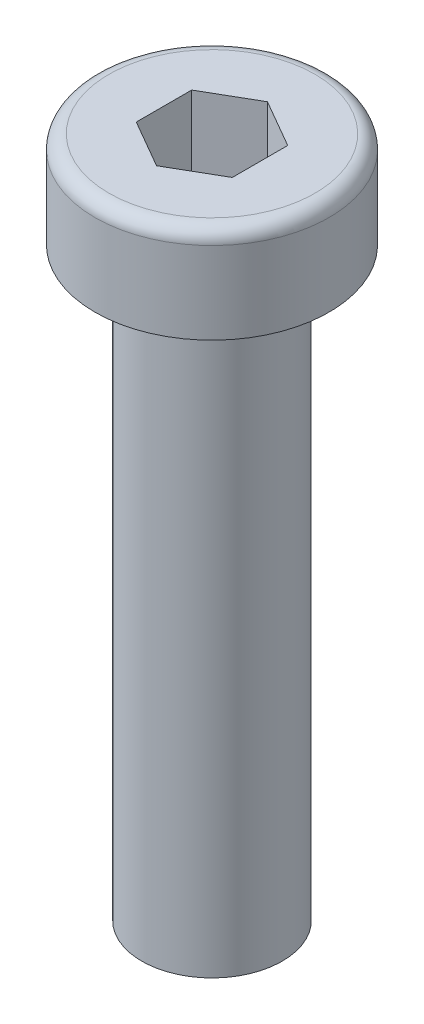
ISO-10303-21;
HEADER;
FILE_DESCRIPTION(('STEP AP214'),'2;1');
FILE_NAME('part.step','',(''),(''),'','','');
FILE_SCHEMA(('AUTOMOTIVE_DESIGN { 1 0 10303 214 1 1 1 1 }'));
ENDSEC;
DATA;
#1=APPLICATION_CONTEXT('core data for automotive mechanical design processes');
#2=APPLICATION_PROTOCOL_DEFINITION('international standard','automotive_design',2000,#1);
#3=PRODUCT_CONTEXT('',#1,'mechanical');
#4=PRODUCT('Part','Part','',(#3));
#5=PRODUCT_RELATED_PRODUCT_CATEGORY('part','',(#4));
#6=PRODUCT_DEFINITION_FORMATION('','',#4);
#7=PRODUCT_DEFINITION_CONTEXT('part definition',#1,'design');
#8=PRODUCT_DEFINITION('design','',#6,#7);
#9=PRODUCT_DEFINITION_SHAPE('','',#8);
#10=(LENGTH_UNIT() NAMED_UNIT(*) SI_UNIT(.MILLI.,.METRE.));
#11=(NAMED_UNIT(*) PLANE_ANGLE_UNIT() SI_UNIT($,.RADIAN.));
#12=(NAMED_UNIT(*) SI_UNIT($,.STERADIAN.) SOLID_ANGLE_UNIT());
#13=UNCERTAINTY_MEASURE_WITH_UNIT(LENGTH_MEASURE(1.E-05),#10,'distance_accuracy_value','');
#14=(GEOMETRIC_REPRESENTATION_CONTEXT(3) GLOBAL_UNCERTAINTY_ASSIGNED_CONTEXT((#13)) GLOBAL_UNIT_ASSIGNED_CONTEXT((#10,
#11,#12)) REPRESENTATION_CONTEXT('',''));
#15=CARTESIAN_POINT('',(0.,0.,0.));
#16=DIRECTION('',(0.,0.,1.));
#17=DIRECTION('',(1.,0.,0.));
#18=AXIS2_PLACEMENT_3D('',#15,#16,#17);
#19=CARTESIAN_POINT('',(0.,4.1,0.));
#20=DIRECTION('',(0.,-1.,0.));
#21=DIRECTION('',(0.,0.,-1.));
#22=AXIS2_PLACEMENT_3D('',#19,#20,#21);
#23=CYLINDRICAL_SURFACE('',#22,5.);
#24=CARTESIAN_POINT('',(0.,3.5,0.));
#25=DIRECTION('',(0.,1.,0.));
#26=DIRECTION('',(0.,0.,1.));
#27=AXIS2_PLACEMENT_3D('',#24,#25,#26);
#28=CIRCLE('',#27,5.);
#29=CARTESIAN_POINT('',(0.,3.5,5.));
#30=VERTEX_POINT('',#29);
#31=EDGE_CURVE('E37',#30,#30,#28,.F.);
#32=ORIENTED_EDGE('',*,*,#31,.T.);
#33=EDGE_LOOP('',(#32));
#34=FACE_BOUND('',#33,.T.);
#35=CARTESIAN_POINT('',(0.,0.,0.));
#36=DIRECTION('',(0.,1.,0.));
#37=DIRECTION('',(0.,0.,1.));
#38=AXIS2_PLACEMENT_3D('',#35,#36,#37);
#39=CIRCLE('',#38,5.);
#40=CARTESIAN_POINT('',(0.,0.,5.));
#41=VERTEX_POINT('',#40);
#42=EDGE_CURVE('E137',#41,#41,#39,.T.);
#43=ORIENTED_EDGE('',*,*,#42,.T.);
#44=EDGE_LOOP('',(#43));
#45=FACE_BOUND('',#44,.T.);
#46=ADVANCED_FACE('F33',(#34,#45),#23,.T.);
#47=CARTESIAN_POINT('',(0.,4.1,0.));
#48=DIRECTION('',(0.,1.,0.));
#49=DIRECTION('',(0.,0.,1.));
#50=AXIS2_PLACEMENT_3D('',#47,#48,#49);
#51=PLANE('',#50);
#52=DIRECTION('',(0.866025403784439,0.,0.5));
#53=VECTOR('',#52,1.);
#54=CARTESIAN_POINT('',(-2.05,4.1,1.18356805183873));
#55=LINE('',#54,#53);
#56=CARTESIAN_POINT('',(-2.05,4.1,1.18356805183873));
#57=VERTEX_POINT('',#56);
#58=CARTESIAN_POINT('',(0.,4.1,2.36713610367747));
#59=VERTEX_POINT('',#58);
#60=EDGE_CURVE('E49',#57,#59,#55,.T.);
#61=ORIENTED_EDGE('',*,*,#60,.F.);
#62=DIRECTION('',(0.,0.,1.));
#63=VECTOR('',#62,1.);
#64=CARTESIAN_POINT('',(-2.05,4.1,-1.18356805183873));
#65=LINE('',#64,#63);
#66=CARTESIAN_POINT('',(-2.05,4.1,-1.18356805183873));
#67=VERTEX_POINT('',#66);
#68=EDGE_CURVE('E133',#67,#57,#65,.T.);
#69=ORIENTED_EDGE('',*,*,#68,.F.);
#70=DIRECTION('',(-0.866025403784438,0.,0.5));
#71=VECTOR('',#70,1.);
#72=CARTESIAN_POINT('',(0.,4.1,-2.36713610367747));
#73=LINE('',#72,#71);
#74=CARTESIAN_POINT('',(0.,4.1,-2.36713610367747));
#75=VERTEX_POINT('',#74);
#76=EDGE_CURVE('E131',#75,#67,#73,.T.);
#77=ORIENTED_EDGE('',*,*,#76,.F.);
#78=DIRECTION('',(-0.866025403784439,0.,-0.5));
#79=VECTOR('',#78,1.);
#80=CARTESIAN_POINT('',(2.05,4.1,-1.18356805183873));
#81=LINE('',#80,#79);
#82=CARTESIAN_POINT('',(2.05,4.1,-1.18356805183873));
#83=VERTEX_POINT('',#82);
#84=EDGE_CURVE('E97',#83,#75,#81,.T.);
#85=ORIENTED_EDGE('',*,*,#84,.F.);
#86=DIRECTION('',(0.,0.,-1.));
#87=VECTOR('',#86,1.);
#88=CARTESIAN_POINT('',(2.05,4.1,1.18356805183873));
#89=LINE('',#88,#87);
#90=CARTESIAN_POINT('',(2.05,4.1,1.18356805183873));
#91=VERTEX_POINT('',#90);
#92=EDGE_CURVE('E127',#91,#83,#89,.T.);
#93=ORIENTED_EDGE('',*,*,#92,.F.);
#94=DIRECTION('',(0.866025403784438,0.,-0.5));
#95=VECTOR('',#94,1.);
#96=CARTESIAN_POINT('',(0.,4.1,2.36713610367747));
#97=LINE('',#96,#95);
#98=EDGE_CURVE('E123',#59,#91,#97,.T.);
#99=ORIENTED_EDGE('',*,*,#98,.F.);
#100=EDGE_LOOP('',(#61,#69,#77,#85,#93,#99));
#101=FACE_BOUND('',#100,.T.);
#102=CARTESIAN_POINT('',(0.,4.1,0.));
#103=DIRECTION('',(0.,1.,0.));
#104=DIRECTION('',(0.,0.,1.));
#105=AXIS2_PLACEMENT_3D('',#102,#103,#104);
#106=CIRCLE('',#105,4.4);
#107=CARTESIAN_POINT('',(0.,4.1,4.4));
#108=VERTEX_POINT('',#107);
#109=EDGE_CURVE('E144',#108,#108,#106,.T.);
#110=ORIENTED_EDGE('',*,*,#109,.T.);
#111=EDGE_LOOP('',(#110));
#112=FACE_BOUND('',#111,.T.);
#113=ADVANCED_FACE('F163',(#101,#112),#51,.T.);
#114=CARTESIAN_POINT('',(0.,0.,0.));
#115=DIRECTION('',(0.,1.,0.));
#116=DIRECTION('',(0.,0.,1.));
#117=AXIS2_PLACEMENT_3D('',#114,#115,#116);
#118=PLANE('',#117);
#119=CARTESIAN_POINT('',(0.,0.,0.));
#120=DIRECTION('',(0.,-1.,0.));
#121=DIRECTION('',(0.,0.,-1.));
#122=AXIS2_PLACEMENT_3D('',#119,#120,#121);
#123=CIRCLE('',#122,3.);
#124=CARTESIAN_POINT('',(0.,0.,-3.));
#125=VERTEX_POINT('',#124);
#126=EDGE_CURVE('E11',#125,#125,#123,.T.);
#127=ORIENTED_EDGE('',*,*,#126,.F.);
#128=EDGE_LOOP('',(#127));
#129=FACE_BOUND('',#128,.T.);
#130=ORIENTED_EDGE('',*,*,#42,.F.);
#131=EDGE_LOOP('',(#130));
#132=FACE_BOUND('',#131,.T.);
#133=ADVANCED_FACE('F156',(#129,#132),#118,.F.);
#134=CARTESIAN_POINT('',(0.,3.5,0.));
#135=DIRECTION('',(0.,1.,0.));
#136=DIRECTION('',(0.,0.,1.));
#137=AXIS2_PLACEMENT_3D('',#134,#135,#136);
#138=TOROIDAL_SURFACE('',#137,4.4,0.6);
#139=ORIENTED_EDGE('',*,*,#31,.F.);
#140=EDGE_LOOP('',(#139));
#141=FACE_BOUND('',#140,.T.);
#142=ORIENTED_EDGE('',*,*,#109,.F.);
#143=EDGE_LOOP('',(#142));
#144=FACE_BOUND('',#143,.T.);
#145=ADVANCED_FACE('F35',(#141,#144),#138,.T.);
#146=CARTESIAN_POINT('',(-2.05,0.5,1.18356805183873));
#147=DIRECTION('',(-0.5,0.,0.866025403784438));
#148=DIRECTION('',(0.866025403784439,0.,0.5));
#149=AXIS2_PLACEMENT_3D('',#146,#147,#148);
#150=PLANE('',#149);
#151=ORIENTED_EDGE('',*,*,#60,.T.);
#152=DIRECTION('',(0.,1.,0.));
#153=VECTOR('',#152,1.);
#154=CARTESIAN_POINT('',(0.,0.5,2.36713610367747));
#155=LINE('',#154,#153);
#156=CARTESIAN_POINT('',(0.,0.5,2.36713610367747));
#157=VERTEX_POINT('',#156);
#158=EDGE_CURVE('E79',#157,#59,#155,.T.);
#159=ORIENTED_EDGE('',*,*,#158,.F.);
#160=DIRECTION('',(0.866025403784439,0.,0.5));
#161=VECTOR('',#160,1.);
#162=CARTESIAN_POINT('',(-2.05,0.5,1.18356805183873));
#163=LINE('',#162,#161);
#164=CARTESIAN_POINT('',(-2.05,0.5,1.18356805183873));
#165=VERTEX_POINT('',#164);
#166=EDGE_CURVE('E135',#165,#157,#163,.T.);
#167=ORIENTED_EDGE('',*,*,#166,.F.);
#168=DIRECTION('',(0.,1.,0.));
#169=VECTOR('',#168,1.);
#170=CARTESIAN_POINT('',(-2.05,0.5,1.18356805183873));
#171=LINE('',#170,#169);
#172=EDGE_CURVE('E57',#165,#57,#171,.T.);
#173=ORIENTED_EDGE('',*,*,#172,.T.);
#174=EDGE_LOOP('',(#151,#159,#167,#173));
#175=FACE_BOUND('',#174,.T.);
#176=ADVANCED_FACE('F155',(#175),#150,.F.);
#177=CARTESIAN_POINT('',(-2.05,0.5,-1.18356805183873));
#178=DIRECTION('',(-1.,0.,0.));
#179=DIRECTION('',(0.,0.,1.));
#180=AXIS2_PLACEMENT_3D('',#177,#178,#179);
#181=PLANE('',#180);
#182=ORIENTED_EDGE('',*,*,#68,.T.);
#183=ORIENTED_EDGE('',*,*,#172,.F.);
#184=DIRECTION('',(0.,0.,1.));
#185=VECTOR('',#184,1.);
#186=CARTESIAN_POINT('',(-2.05,0.5,-1.18356805183873));
#187=LINE('',#186,#185);
#188=CARTESIAN_POINT('',(-2.05,0.5,-1.18356805183873));
#189=VERTEX_POINT('',#188);
#190=EDGE_CURVE('E109',#189,#165,#187,.T.);
#191=ORIENTED_EDGE('',*,*,#190,.F.);
#192=DIRECTION('',(0.,1.,0.));
#193=VECTOR('',#192,1.);
#194=CARTESIAN_POINT('',(-2.05,0.5,-1.18356805183873));
#195=LINE('',#194,#193);
#196=EDGE_CURVE('E101',#189,#67,#195,.T.);
#197=ORIENTED_EDGE('',*,*,#196,.T.);
#198=EDGE_LOOP('',(#182,#183,#191,#197));
#199=FACE_BOUND('',#198,.T.);
#200=ADVANCED_FACE('F161',(#199),#181,.F.);
#201=CARTESIAN_POINT('',(0.,0.5,-2.36713610367747));
#202=DIRECTION('',(-0.5,0.,-0.866025403784439));
#203=DIRECTION('',(-0.866025403784439,0.,0.5));
#204=AXIS2_PLACEMENT_3D('',#201,#202,#203);
#205=PLANE('',#204);
#206=ORIENTED_EDGE('',*,*,#76,.T.);
#207=ORIENTED_EDGE('',*,*,#196,.F.);
#208=DIRECTION('',(-0.866025403784438,0.,0.5));
#209=VECTOR('',#208,1.);
#210=CARTESIAN_POINT('',(0.,0.5,-2.36713610367747));
#211=LINE('',#210,#209);
#212=CARTESIAN_POINT('',(0.,0.5,-2.36713610367747));
#213=VERTEX_POINT('',#212);
#214=EDGE_CURVE('E105',#213,#189,#211,.T.);
#215=ORIENTED_EDGE('',*,*,#214,.F.);
#216=DIRECTION('',(0.,1.,0.));
#217=VECTOR('',#216,1.);
#218=CARTESIAN_POINT('',(0.,0.5,-2.36713610367747));
#219=LINE('',#218,#217);
#220=EDGE_CURVE('E90',#213,#75,#219,.T.);
#221=ORIENTED_EDGE('',*,*,#220,.T.);
#222=EDGE_LOOP('',(#206,#207,#215,#221));
#223=FACE_BOUND('',#222,.T.);
#224=ADVANCED_FACE('F106',(#223),#205,.F.);
#225=CARTESIAN_POINT('',(2.05,0.5,-1.18356805183873));
#226=DIRECTION('',(0.5,0.,-0.866025403784439));
#227=DIRECTION('',(-0.866025403784439,0.,-0.5));
#228=AXIS2_PLACEMENT_3D('',#225,#226,#227);
#229=PLANE('',#228);
#230=ORIENTED_EDGE('',*,*,#84,.T.);
#231=ORIENTED_EDGE('',*,*,#220,.F.);
#232=DIRECTION('',(-0.866025403784439,0.,-0.5));
#233=VECTOR('',#232,1.);
#234=CARTESIAN_POINT('',(2.05,0.5,-1.18356805183873));
#235=LINE('',#234,#233);
#236=CARTESIAN_POINT('',(2.05,0.5,-1.18356805183873));
#237=VERTEX_POINT('',#236);
#238=EDGE_CURVE('E94',#237,#213,#235,.T.);
#239=ORIENTED_EDGE('',*,*,#238,.F.);
#240=DIRECTION('',(0.,1.,0.));
#241=VECTOR('',#240,1.);
#242=CARTESIAN_POINT('',(2.05,0.5,-1.18356805183873));
#243=LINE('',#242,#241);
#244=EDGE_CURVE('E102',#237,#83,#243,.T.);
#245=ORIENTED_EDGE('',*,*,#244,.T.);
#246=EDGE_LOOP('',(#230,#231,#239,#245));
#247=FACE_BOUND('',#246,.T.);
#248=ADVANCED_FACE('F92',(#247),#229,.F.);
#249=CARTESIAN_POINT('',(2.05,0.5,1.18356805183873));
#250=DIRECTION('',(1.,0.,0.));
#251=DIRECTION('',(0.,0.,-1.));
#252=AXIS2_PLACEMENT_3D('',#249,#250,#251);
#253=PLANE('',#252);
#254=ORIENTED_EDGE('',*,*,#92,.T.);
#255=ORIENTED_EDGE('',*,*,#244,.F.);
#256=DIRECTION('',(0.,0.,-1.));
#257=VECTOR('',#256,1.);
#258=CARTESIAN_POINT('',(2.05,0.5,1.18356805183873));
#259=LINE('',#258,#257);
#260=CARTESIAN_POINT('',(2.05,0.5,1.18356805183873));
#261=VERTEX_POINT('',#260);
#262=EDGE_CURVE('E115',#261,#237,#259,.T.);
#263=ORIENTED_EDGE('',*,*,#262,.F.);
#264=DIRECTION('',(0.,1.,0.));
#265=VECTOR('',#264,1.);
#266=CARTESIAN_POINT('',(2.05,0.5,1.18356805183873));
#267=LINE('',#266,#265);
#268=EDGE_CURVE('E140',#261,#91,#267,.T.);
#269=ORIENTED_EDGE('',*,*,#268,.T.);
#270=EDGE_LOOP('',(#254,#255,#263,#269));
#271=FACE_BOUND('',#270,.T.);
#272=ADVANCED_FACE('F176',(#271),#253,.F.);
#273=CARTESIAN_POINT('',(0.,0.5,2.36713610367747));
#274=DIRECTION('',(0.5,0.,0.866025403784439));
#275=DIRECTION('',(0.866025403784439,0.,-0.5));
#276=AXIS2_PLACEMENT_3D('',#273,#274,#275);
#277=PLANE('',#276);
#278=ORIENTED_EDGE('',*,*,#98,.T.);
#279=ORIENTED_EDGE('',*,*,#268,.F.);
#280=DIRECTION('',(0.866025403784438,0.,-0.5));
#281=VECTOR('',#280,1.);
#282=CARTESIAN_POINT('',(0.,0.5,2.36713610367747));
#283=LINE('',#282,#281);
#284=EDGE_CURVE('E117',#157,#261,#283,.T.);
#285=ORIENTED_EDGE('',*,*,#284,.F.);
#286=ORIENTED_EDGE('',*,*,#158,.T.);
#287=EDGE_LOOP('',(#278,#279,#285,#286));
#288=FACE_BOUND('',#287,.T.);
#289=ADVANCED_FACE('F173',(#288),#277,.F.);
#290=CARTESIAN_POINT('',(0.,0.5,0.));
#291=DIRECTION('',(0.,1.,0.));
#292=DIRECTION('',(0.,0.,1.));
#293=AXIS2_PLACEMENT_3D('',#290,#291,#292);
#294=PLANE('',#293);
#295=ORIENTED_EDGE('',*,*,#166,.T.);
#296=ORIENTED_EDGE('',*,*,#284,.T.);
#297=ORIENTED_EDGE('',*,*,#262,.T.);
#298=ORIENTED_EDGE('',*,*,#238,.T.);
#299=ORIENTED_EDGE('',*,*,#214,.T.);
#300=ORIENTED_EDGE('',*,*,#190,.T.);
#301=EDGE_LOOP('',(#295,#296,#297,#298,#299,#300));
#302=FACE_BOUND('',#301,.T.);
#303=ADVANCED_FACE('F112',(#302),#294,.T.);
#304=CARTESIAN_POINT('',(0.,-25.,0.));
#305=DIRECTION('',(0.,1.,0.));
#306=DIRECTION('',(0.,0.,1.));
#307=AXIS2_PLACEMENT_3D('',#304,#305,#306);
#308=CYLINDRICAL_SURFACE('',#307,3.);
#309=CARTESIAN_POINT('',(0.,-25.,0.));
#310=DIRECTION('',(0.,-1.,0.));
#311=DIRECTION('',(0.,0.,-1.));
#312=AXIS2_PLACEMENT_3D('',#309,#310,#311);
#313=CIRCLE('',#312,3.);
#314=CARTESIAN_POINT('',(0.,-25.,-3.));
#315=VERTEX_POINT('',#314);
#316=EDGE_CURVE('E124',#315,#315,#313,.T.);
#317=ORIENTED_EDGE('',*,*,#316,.F.);
#318=EDGE_LOOP('',(#317));
#319=FACE_BOUND('',#318,.T.);
#320=ORIENTED_EDGE('',*,*,#126,.T.);
#321=EDGE_LOOP('',(#320));
#322=FACE_BOUND('',#321,.T.);
#323=ADVANCED_FACE('F189',(#319,#322),#308,.T.);
#324=CARTESIAN_POINT('',(0.,-25.,0.));
#325=DIRECTION('',(0.,-1.,0.));
#326=DIRECTION('',(0.,0.,-1.));
#327=AXIS2_PLACEMENT_3D('',#324,#325,#326);
#328=PLANE('',#327);
#329=ORIENTED_EDGE('',*,*,#316,.T.);
#330=EDGE_LOOP('',(#329));
#331=FACE_BOUND('',#330,.T.);
#332=ADVANCED_FACE('F192',(#331),#328,.T.);
#333=CLOSED_SHELL('',(#46,#113,#133,#145,#176,#200,#224,#248,#272,#289,#303,#323,#332));
#334=MANIFOLD_SOLID_BREP('B2',#333);
#335=ADVANCED_BREP_SHAPE_REPRESENTATION('',(#18,#334),#14);
#336=SHAPE_DEFINITION_REPRESENTATION(#9,#335);
ENDSEC;
END-ISO-10303-21;
